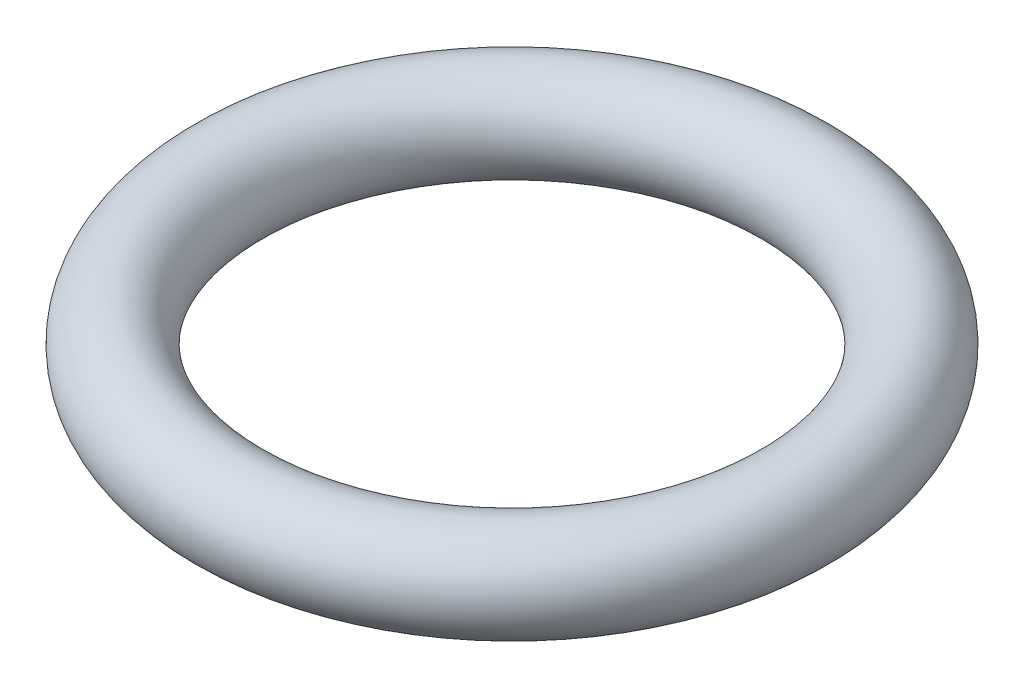
ISO-10303-21;
HEADER;
FILE_DESCRIPTION(('STEP AP214'),'2;1');
FILE_NAME('part.step','',(''),(''),'','','');
FILE_SCHEMA(('AUTOMOTIVE_DESIGN { 1 0 10303 214 1 1 1 1 }'));
ENDSEC;
DATA;
#1=APPLICATION_CONTEXT('core data for automotive mechanical design processes');
#2=APPLICATION_PROTOCOL_DEFINITION('international standard','automotive_design',2000,#1);
#3=PRODUCT_CONTEXT('',#1,'mechanical');
#4=PRODUCT('Part','Part','',(#3));
#5=PRODUCT_RELATED_PRODUCT_CATEGORY('part','',(#4));
#6=PRODUCT_DEFINITION_FORMATION('','',#4);
#7=PRODUCT_DEFINITION_CONTEXT('part definition',#1,'design');
#8=PRODUCT_DEFINITION('design','',#6,#7);
#9=PRODUCT_DEFINITION_SHAPE('','',#8);
#10=(LENGTH_UNIT() NAMED_UNIT(*) SI_UNIT(.MILLI.,.METRE.));
#11=(NAMED_UNIT(*) PLANE_ANGLE_UNIT() SI_UNIT($,.RADIAN.));
#12=(NAMED_UNIT(*) SI_UNIT($,.STERADIAN.) SOLID_ANGLE_UNIT());
#13=UNCERTAINTY_MEASURE_WITH_UNIT(LENGTH_MEASURE(1.E-05),#10,'distance_accuracy_value','');
#14=(GEOMETRIC_REPRESENTATION_CONTEXT(3) GLOBAL_UNCERTAINTY_ASSIGNED_CONTEXT((#13)) GLOBAL_UNIT_ASSIGNED_CONTEXT((#10,
#11,#12)) REPRESENTATION_CONTEXT('',''));
#15=CARTESIAN_POINT('',(0.,0.,0.));
#16=DIRECTION('',(0.,0.,1.));
#17=DIRECTION('',(1.,0.,0.));
#18=AXIS2_PLACEMENT_3D('',#15,#16,#17);
#19=CARTESIAN_POINT('',(0.,0.,0.));
#20=DIRECTION('',(0.,-1.,0.));
#21=DIRECTION('',(0.,0.,-1.));
#22=AXIS2_PLACEMENT_3D('',#19,#20,#21);
#23=TOROIDAL_SURFACE('',#22,3.,0.5);
#24=CARTESIAN_POINT('',(0.,0.,-3.5));
#25=VERTEX_POINT('',#24);
#26=VERTEX_LOOP('',#25);
#27=FACE_BOUND('',#26,.T.);
#28=ADVANCED_FACE('F29',(#27),#23,.T.);
#29=CLOSED_SHELL('',(#28));
#30=MANIFOLD_SOLID_BREP('B2',#29);
#31=ADVANCED_BREP_SHAPE_REPRESENTATION('',(#18,#30),#14);
#32=SHAPE_DEFINITION_REPRESENTATION(#9,#31);
ENDSEC;
END-ISO-10303-21;
